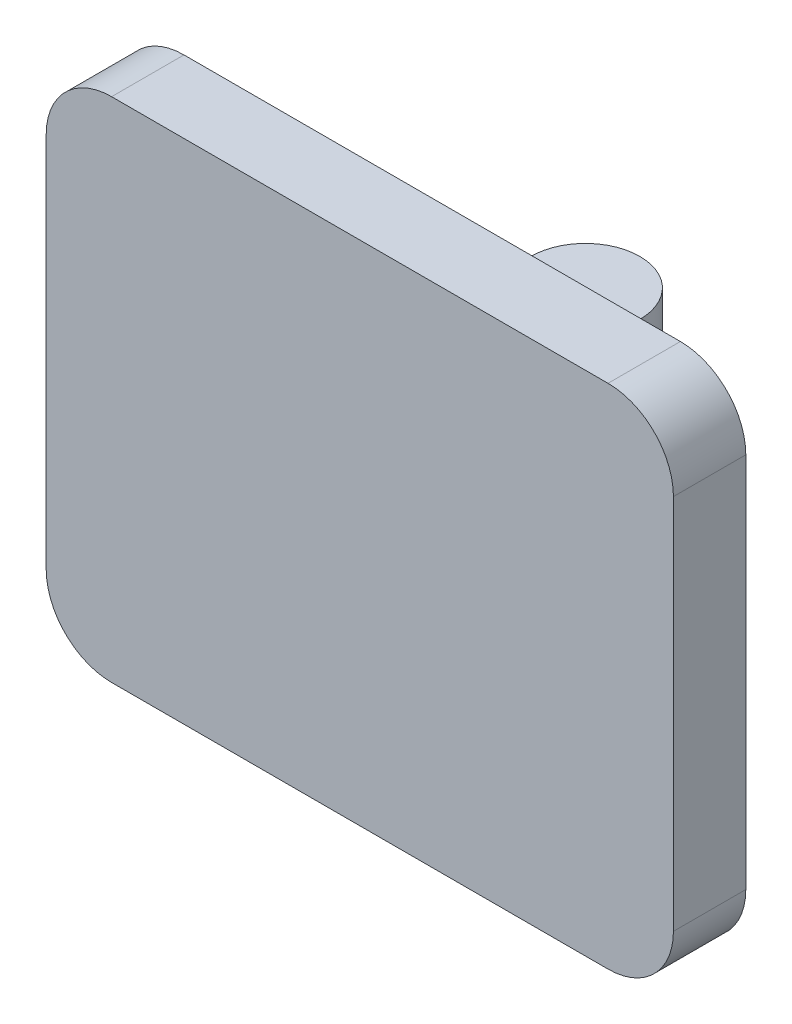
ISO-10303-21;
HEADER;
FILE_DESCRIPTION(('STEP AP214'),'2;1');
FILE_NAME('part.step','',(''),(''),'','','');
FILE_SCHEMA(('AUTOMOTIVE_DESIGN { 1 0 10303 214 1 1 1 1 }'));
ENDSEC;
DATA;
#1=APPLICATION_CONTEXT('core data for automotive mechanical design processes');
#2=APPLICATION_PROTOCOL_DEFINITION('international standard','automotive_design',2000,#1);
#3=PRODUCT_CONTEXT('',#1,'mechanical');
#4=PRODUCT('Part','Part','',(#3));
#5=PRODUCT_RELATED_PRODUCT_CATEGORY('part','',(#4));
#6=PRODUCT_DEFINITION_FORMATION('','',#4);
#7=PRODUCT_DEFINITION_CONTEXT('part definition',#1,'design');
#8=PRODUCT_DEFINITION('design','',#6,#7);
#9=PRODUCT_DEFINITION_SHAPE('','',#8);
#10=(LENGTH_UNIT() NAMED_UNIT(*) SI_UNIT(.MILLI.,.METRE.));
#11=(NAMED_UNIT(*) PLANE_ANGLE_UNIT() SI_UNIT($,.RADIAN.));
#12=(NAMED_UNIT(*) SI_UNIT($,.STERADIAN.) SOLID_ANGLE_UNIT());
#13=UNCERTAINTY_MEASURE_WITH_UNIT(LENGTH_MEASURE(1.E-05),#10,'distance_accuracy_value','');
#14=(GEOMETRIC_REPRESENTATION_CONTEXT(3) GLOBAL_UNCERTAINTY_ASSIGNED_CONTEXT((#13)) GLOBAL_UNIT_ASSIGNED_CONTEXT((#10,
#11,#12)) REPRESENTATION_CONTEXT('',''));
#15=CARTESIAN_POINT('',(0.,0.,0.));
#16=DIRECTION('',(0.,0.,1.));
#17=DIRECTION('',(1.,0.,0.));
#18=AXIS2_PLACEMENT_3D('',#15,#16,#17);
#19=CARTESIAN_POINT('',(113.85,-86.35,0.));
#20=DIRECTION('',(0.,0.,1.));
#21=DIRECTION('',(1.,0.,0.));
#22=AXIS2_PLACEMENT_3D('',#19,#20,#21);
#23=PLANE('',#22);
#24=CARTESIAN_POINT('',(56.845,-87.4,0.));
#25=DIRECTION('',(0.,0.,-1.));
#26=DIRECTION('',(-1.,0.,0.));
#27=AXIS2_PLACEMENT_3D('',#24,#25,#26);
#28=CIRCLE('',#27,6.50000000000001);
#29=CARTESIAN_POINT('',(56.845,-80.9,0.));
#30=VERTEX_POINT('',#29);
#31=CARTESIAN_POINT('',(56.845,-93.9,0.));
#32=VERTEX_POINT('',#31);
#33=EDGE_CURVE('E207',#30,#32,#28,.T.);
#34=ORIENTED_EDGE('',*,*,#33,.F.);
#35=DIRECTION('',(1.,0.,0.));
#36=VECTOR('',#35,1.);
#37=CARTESIAN_POINT('',(56.845,-80.9,0.));
#38=LINE('',#37,#36);
#39=CARTESIAN_POINT('',(-56.845,-80.9,0.));
#40=VERTEX_POINT('',#39);
#41=EDGE_CURVE('E212',#40,#30,#38,.T.);
#42=ORIENTED_EDGE('',*,*,#41,.F.);
#43=CARTESIAN_POINT('',(-56.845,-87.4,0.));
#44=DIRECTION('',(0.,0.,-1.));
#45=DIRECTION('',(-1.,0.,0.));
#46=AXIS2_PLACEMENT_3D('',#43,#44,#45);
#47=CIRCLE('',#46,6.50000000000001);
#48=CARTESIAN_POINT('',(-56.845,-93.9,0.));
#49=VERTEX_POINT('',#48);
#50=EDGE_CURVE('E222',#49,#40,#47,.T.);
#51=ORIENTED_EDGE('',*,*,#50,.F.);
#52=DIRECTION('',(-1.,0.,0.));
#53=VECTOR('',#52,1.);
#54=CARTESIAN_POINT('',(56.845,-93.9,0.));
#55=LINE('',#54,#53);
#56=EDGE_CURVE('E57',#32,#49,#55,.T.);
#57=ORIENTED_EDGE('',*,*,#56,.F.);
#58=EDGE_LOOP('',(#34,#42,#51,#57));
#59=FACE_BOUND('',#58,.T.);
#60=CARTESIAN_POINT('',(113.85,-86.35,0.));
#61=DIRECTION('',(0.,0.,1.));
#62=DIRECTION('',(1.,0.,0.));
#63=AXIS2_PLACEMENT_3D('',#60,#61,#62);
#64=CIRCLE('',#63,30.);
#65=CARTESIAN_POINT('',(113.85,-116.35,0.));
#66=VERTEX_POINT('',#65);
#67=CARTESIAN_POINT('',(143.85,-86.3499999999998,0.));
#68=VERTEX_POINT('',#67);
#69=EDGE_CURVE('E237',#66,#68,#64,.T.);
#70=ORIENTED_EDGE('',*,*,#69,.F.);
#71=DIRECTION('',(1.,0.,0.));
#72=VECTOR('',#71,1.);
#73=CARTESIAN_POINT('',(-113.85,-116.35,0.));
#74=LINE('',#73,#72);
#75=CARTESIAN_POINT('',(-113.85,-116.35,0.));
#76=VERTEX_POINT('',#75);
#77=EDGE_CURVE('E242',#76,#66,#74,.T.);
#78=ORIENTED_EDGE('',*,*,#77,.F.);
#79=CARTESIAN_POINT('',(-113.85,-86.35,0.));
#80=DIRECTION('',(0.,0.,1.));
#81=DIRECTION('',(1.,0.,0.));
#82=AXIS2_PLACEMENT_3D('',#79,#80,#81);
#83=CIRCLE('',#82,30.);
#84=CARTESIAN_POINT('',(-143.85,-86.3499999999998,0.));
#85=VERTEX_POINT('',#84);
#86=EDGE_CURVE('E269',#85,#76,#83,.T.);
#87=ORIENTED_EDGE('',*,*,#86,.F.);
#88=DIRECTION('',(0.,-1.,0.));
#89=VECTOR('',#88,1.);
#90=CARTESIAN_POINT('',(-143.85,86.3499999999998,0.));
#91=LINE('',#90,#89);
#92=CARTESIAN_POINT('',(-143.85,86.3499999999998,0.));
#93=VERTEX_POINT('',#92);
#94=EDGE_CURVE('E267',#93,#85,#91,.T.);
#95=ORIENTED_EDGE('',*,*,#94,.F.);
#96=CARTESIAN_POINT('',(-113.85,86.35,0.));
#97=DIRECTION('',(0.,0.,1.));
#98=DIRECTION('',(1.,0.,0.));
#99=AXIS2_PLACEMENT_3D('',#96,#97,#98);
#100=CIRCLE('',#99,30.);
#101=CARTESIAN_POINT('',(-113.85,116.35,0.));
#102=VERTEX_POINT('',#101);
#103=EDGE_CURVE('E265',#102,#93,#100,.T.);
#104=ORIENTED_EDGE('',*,*,#103,.F.);
#105=DIRECTION('',(-1.,0.,0.));
#106=VECTOR('',#105,1.);
#107=CARTESIAN_POINT('',(-113.85,116.35,0.));
#108=LINE('',#107,#106);
#109=CARTESIAN_POINT('',(113.85,116.35,0.));
#110=VERTEX_POINT('',#109);
#111=EDGE_CURVE('E263',#110,#102,#108,.T.);
#112=ORIENTED_EDGE('',*,*,#111,.F.);
#113=CARTESIAN_POINT('',(113.85,86.35,0.));
#114=DIRECTION('',(0.,0.,1.));
#115=DIRECTION('',(-1.,0.,0.));
#116=AXIS2_PLACEMENT_3D('',#113,#114,#115);
#117=CIRCLE('',#116,30.);
#118=CARTESIAN_POINT('',(143.85,86.3499999999998,0.));
#119=VERTEX_POINT('',#118);
#120=EDGE_CURVE('E261',#119,#110,#117,.T.);
#121=ORIENTED_EDGE('',*,*,#120,.F.);
#122=DIRECTION('',(0.,1.,0.));
#123=VECTOR('',#122,1.);
#124=CARTESIAN_POINT('',(143.85,86.3499999999998,0.));
#125=LINE('',#124,#123);
#126=EDGE_CURVE('E259',#68,#119,#125,.T.);
#127=ORIENTED_EDGE('',*,*,#126,.F.);
#128=EDGE_LOOP('',(#70,#78,#87,#95,#104,#112,#121,#127));
#129=FACE_BOUND('',#128,.T.);
#130=DIRECTION('',(-1.,0.,0.));
#131=VECTOR('',#130,1.);
#132=CARTESIAN_POINT('',(0.,11.65,0.));
#133=LINE('',#132,#131);
#134=CARTESIAN_POINT('',(47.95,11.65,0.));
#135=VERTEX_POINT('',#134);
#136=CARTESIAN_POINT('',(31.95,11.65,0.));
#137=VERTEX_POINT('',#136);
#138=EDGE_CURVE('E173',#135,#137,#133,.T.);
#139=ORIENTED_EDGE('',*,*,#138,.F.);
#140=DIRECTION('',(0.,1.,0.));
#141=VECTOR('',#140,1.);
#142=CARTESIAN_POINT('',(47.95,11.65,0.));
#143=LINE('',#142,#141);
#144=CARTESIAN_POINT('',(47.95,85.55,0.));
#145=VERTEX_POINT('',#144);
#146=EDGE_CURVE('E192',#135,#145,#143,.T.);
#147=ORIENTED_EDGE('',*,*,#146,.T.);
#148=DIRECTION('',(-1.,0.,0.));
#149=VECTOR('',#148,1.);
#150=CARTESIAN_POINT('',(0.,85.55,0.));
#151=LINE('',#150,#149);
#152=CARTESIAN_POINT('',(31.95,85.55,0.));
#153=VERTEX_POINT('',#152);
#154=EDGE_CURVE('E185',#145,#153,#151,.T.);
#155=ORIENTED_EDGE('',*,*,#154,.T.);
#156=DIRECTION('',(0.,1.,0.));
#157=VECTOR('',#156,1.);
#158=CARTESIAN_POINT('',(31.95,11.65,0.));
#159=LINE('',#158,#157);
#160=EDGE_CURVE('E158',#137,#153,#159,.T.);
#161=ORIENTED_EDGE('',*,*,#160,.F.);
#162=EDGE_LOOP('',(#139,#147,#155,#161));
#163=FACE_BOUND('',#162,.T.);
#164=ADVANCED_FACE('F34',(#59,#129,#163),#23,.F.);
#165=CARTESIAN_POINT('',(113.85,-86.35,33.2));
#166=DIRECTION('',(0.,0.,-1.));
#167=DIRECTION('',(-1.,0.,0.));
#168=AXIS2_PLACEMENT_3D('',#165,#166,#167);
#169=CYLINDRICAL_SURFACE('',#168,30.);
#170=ORIENTED_EDGE('',*,*,#69,.T.);
#171=DIRECTION('',(0.,0.,-1.));
#172=VECTOR('',#171,1.);
#173=CARTESIAN_POINT('',(143.85,-86.3499999999998,33.2));
#174=LINE('',#173,#172);
#175=CARTESIAN_POINT('',(143.85,-86.3499999999998,33.2));
#176=VERTEX_POINT('',#175);
#177=EDGE_CURVE('E11',#176,#68,#174,.T.);
#178=ORIENTED_EDGE('',*,*,#177,.F.);
#179=CARTESIAN_POINT('',(113.85,-86.35,33.2));
#180=DIRECTION('',(0.,0.,1.));
#181=DIRECTION('',(1.,0.,0.));
#182=AXIS2_PLACEMENT_3D('',#179,#180,#181);
#183=CIRCLE('',#182,30.);
#184=CARTESIAN_POINT('',(113.85,-116.35,33.2));
#185=VERTEX_POINT('',#184);
#186=EDGE_CURVE('E238',#185,#176,#183,.T.);
#187=ORIENTED_EDGE('',*,*,#186,.F.);
#188=DIRECTION('',(0.,0.,-1.));
#189=VECTOR('',#188,1.);
#190=CARTESIAN_POINT('',(113.85,-116.35,33.2));
#191=LINE('',#190,#189);
#192=EDGE_CURVE('E256',#185,#66,#191,.T.);
#193=ORIENTED_EDGE('',*,*,#192,.T.);
#194=EDGE_LOOP('',(#170,#178,#187,#193));
#195=FACE_BOUND('',#194,.T.);
#196=ADVANCED_FACE('F36',(#195),#169,.T.);
#197=CARTESIAN_POINT('',(143.85,86.3499999999998,33.2));
#198=DIRECTION('',(-1.,0.,0.));
#199=DIRECTION('',(0.,0.,1.));
#200=AXIS2_PLACEMENT_3D('',#197,#198,#199);
#201=PLANE('',#200);
#202=ORIENTED_EDGE('',*,*,#126,.T.);
#203=DIRECTION('',(0.,0.,-1.));
#204=VECTOR('',#203,1.);
#205=CARTESIAN_POINT('',(143.85,86.3499999999998,33.2));
#206=LINE('',#205,#204);
#207=CARTESIAN_POINT('',(143.85,86.3499999999998,33.2));
#208=VERTEX_POINT('',#207);
#209=EDGE_CURVE('E42',#208,#119,#206,.T.);
#210=ORIENTED_EDGE('',*,*,#209,.F.);
#211=DIRECTION('',(0.,1.,0.));
#212=VECTOR('',#211,1.);
#213=CARTESIAN_POINT('',(143.85,86.3499999999998,33.2));
#214=LINE('',#213,#212);
#215=EDGE_CURVE('E241',#176,#208,#214,.T.);
#216=ORIENTED_EDGE('',*,*,#215,.F.);
#217=ORIENTED_EDGE('',*,*,#177,.T.);
#218=EDGE_LOOP('',(#202,#210,#216,#217));
#219=FACE_BOUND('',#218,.T.);
#220=ADVANCED_FACE('F316',(#219),#201,.F.);
#221=CARTESIAN_POINT('',(113.85,86.35,33.2));
#222=DIRECTION('',(0.,0.,-1.));
#223=DIRECTION('',(-1.,0.,0.));
#224=AXIS2_PLACEMENT_3D('',#221,#222,#223);
#225=CYLINDRICAL_SURFACE('',#224,30.);
#226=ORIENTED_EDGE('',*,*,#120,.T.);
#227=DIRECTION('',(0.,0.,-1.));
#228=VECTOR('',#227,1.);
#229=CARTESIAN_POINT('',(113.85,116.35,33.2));
#230=LINE('',#229,#228);
#231=CARTESIAN_POINT('',(113.85,116.35,33.2));
#232=VERTEX_POINT('',#231);
#233=EDGE_CURVE('E286',#232,#110,#230,.T.);
#234=ORIENTED_EDGE('',*,*,#233,.F.);
#235=CARTESIAN_POINT('',(113.85,86.35,33.2));
#236=DIRECTION('',(0.,0.,1.));
#237=DIRECTION('',(-1.,0.,0.));
#238=AXIS2_PLACEMENT_3D('',#235,#236,#237);
#239=CIRCLE('',#238,30.);
#240=EDGE_CURVE('E244',#208,#232,#239,.T.);
#241=ORIENTED_EDGE('',*,*,#240,.F.);
#242=ORIENTED_EDGE('',*,*,#209,.T.);
#243=EDGE_LOOP('',(#226,#234,#241,#242));
#244=FACE_BOUND('',#243,.T.);
#245=ADVANCED_FACE('F293',(#244),#225,.T.);
#246=CARTESIAN_POINT('',(-113.85,116.35,33.2));
#247=DIRECTION('',(0.,-1.,0.));
#248=DIRECTION('',(0.,0.,-1.));
#249=AXIS2_PLACEMENT_3D('',#246,#247,#248);
#250=PLANE('',#249);
#251=ORIENTED_EDGE('',*,*,#111,.T.);
#252=DIRECTION('',(0.,0.,-1.));
#253=VECTOR('',#252,1.);
#254=CARTESIAN_POINT('',(-113.85,116.35,33.2));
#255=LINE('',#254,#253);
#256=CARTESIAN_POINT('',(-113.85,116.35,33.2));
#257=VERTEX_POINT('',#256);
#258=EDGE_CURVE('E283',#257,#102,#255,.T.);
#259=ORIENTED_EDGE('',*,*,#258,.F.);
#260=DIRECTION('',(-1.,0.,0.));
#261=VECTOR('',#260,1.);
#262=CARTESIAN_POINT('',(-113.85,116.35,33.2));
#263=LINE('',#262,#261);
#264=EDGE_CURVE('E246',#232,#257,#263,.T.);
#265=ORIENTED_EDGE('',*,*,#264,.F.);
#266=ORIENTED_EDGE('',*,*,#233,.T.);
#267=EDGE_LOOP('',(#251,#259,#265,#266));
#268=FACE_BOUND('',#267,.T.);
#269=ADVANCED_FACE('F304',(#268),#250,.F.);
#270=CARTESIAN_POINT('',(-113.85,86.35,33.2));
#271=DIRECTION('',(0.,0.,-1.));
#272=DIRECTION('',(-1.,0.,0.));
#273=AXIS2_PLACEMENT_3D('',#270,#271,#272);
#274=CYLINDRICAL_SURFACE('',#273,30.);
#275=ORIENTED_EDGE('',*,*,#103,.T.);
#276=DIRECTION('',(0.,0.,-1.));
#277=VECTOR('',#276,1.);
#278=CARTESIAN_POINT('',(-143.85,86.3499999999998,33.2));
#279=LINE('',#278,#277);
#280=CARTESIAN_POINT('',(-143.85,86.3499999999998,33.2));
#281=VERTEX_POINT('',#280);
#282=EDGE_CURVE('E280',#281,#93,#279,.T.);
#283=ORIENTED_EDGE('',*,*,#282,.F.);
#284=CARTESIAN_POINT('',(-113.85,86.35,33.2));
#285=DIRECTION('',(0.,0.,1.));
#286=DIRECTION('',(1.,0.,0.));
#287=AXIS2_PLACEMENT_3D('',#284,#285,#286);
#288=CIRCLE('',#287,30.);
#289=EDGE_CURVE('E248',#257,#281,#288,.T.);
#290=ORIENTED_EDGE('',*,*,#289,.F.);
#291=ORIENTED_EDGE('',*,*,#258,.T.);
#292=EDGE_LOOP('',(#275,#283,#290,#291));
#293=FACE_BOUND('',#292,.T.);
#294=ADVANCED_FACE('F308',(#293),#274,.T.);
#295=CARTESIAN_POINT('',(-143.85,86.3499999999998,33.2));
#296=DIRECTION('',(1.,0.,0.));
#297=DIRECTION('',(0.,1.,0.));
#298=AXIS2_PLACEMENT_3D('',#295,#296,#297);
#299=PLANE('',#298);
#300=ORIENTED_EDGE('',*,*,#94,.T.);
#301=DIRECTION('',(0.,0.,-1.));
#302=VECTOR('',#301,1.);
#303=CARTESIAN_POINT('',(-143.85,-86.3499999999998,33.2));
#304=LINE('',#303,#302);
#305=CARTESIAN_POINT('',(-143.85,-86.3499999999998,33.2));
#306=VERTEX_POINT('',#305);
#307=EDGE_CURVE('E277',#306,#85,#304,.T.);
#308=ORIENTED_EDGE('',*,*,#307,.F.);
#309=DIRECTION('',(0.,-1.,0.));
#310=VECTOR('',#309,1.);
#311=CARTESIAN_POINT('',(-143.85,86.3499999999998,33.2));
#312=LINE('',#311,#310);
#313=EDGE_CURVE('E250',#281,#306,#312,.T.);
#314=ORIENTED_EDGE('',*,*,#313,.F.);
#315=ORIENTED_EDGE('',*,*,#282,.T.);
#316=EDGE_LOOP('',(#300,#308,#314,#315));
#317=FACE_BOUND('',#316,.T.);
#318=ADVANCED_FACE('F329',(#317),#299,.F.);
#319=CARTESIAN_POINT('',(-113.85,-86.35,33.2));
#320=DIRECTION('',(0.,0.,-1.));
#321=DIRECTION('',(-1.,0.,0.));
#322=AXIS2_PLACEMENT_3D('',#319,#320,#321);
#323=CYLINDRICAL_SURFACE('',#322,30.);
#324=ORIENTED_EDGE('',*,*,#86,.T.);
#325=DIRECTION('',(0.,0.,-1.));
#326=VECTOR('',#325,1.);
#327=CARTESIAN_POINT('',(-113.85,-116.35,33.2));
#328=LINE('',#327,#326);
#329=CARTESIAN_POINT('',(-113.85,-116.35,33.2));
#330=VERTEX_POINT('',#329);
#331=EDGE_CURVE('E274',#330,#76,#328,.T.);
#332=ORIENTED_EDGE('',*,*,#331,.F.);
#333=CARTESIAN_POINT('',(-113.85,-86.35,33.2));
#334=DIRECTION('',(0.,0.,1.));
#335=DIRECTION('',(1.,0.,0.));
#336=AXIS2_PLACEMENT_3D('',#333,#334,#335);
#337=CIRCLE('',#336,30.);
#338=EDGE_CURVE('E252',#306,#330,#337,.T.);
#339=ORIENTED_EDGE('',*,*,#338,.F.);
#340=ORIENTED_EDGE('',*,*,#307,.T.);
#341=EDGE_LOOP('',(#324,#332,#339,#340));
#342=FACE_BOUND('',#341,.T.);
#343=ADVANCED_FACE('F327',(#342),#323,.T.);
#344=CARTESIAN_POINT('',(-113.85,-116.35,33.2));
#345=DIRECTION('',(0.,1.,0.));
#346=DIRECTION('',(0.,0.,1.));
#347=AXIS2_PLACEMENT_3D('',#344,#345,#346);
#348=PLANE('',#347);
#349=ORIENTED_EDGE('',*,*,#77,.T.);
#350=ORIENTED_EDGE('',*,*,#192,.F.);
#351=DIRECTION('',(1.,0.,0.));
#352=VECTOR('',#351,1.);
#353=CARTESIAN_POINT('',(-113.85,-116.35,33.2));
#354=LINE('',#353,#352);
#355=EDGE_CURVE('E254',#330,#185,#354,.T.);
#356=ORIENTED_EDGE('',*,*,#355,.F.);
#357=ORIENTED_EDGE('',*,*,#331,.T.);
#358=EDGE_LOOP('',(#349,#350,#356,#357));
#359=FACE_BOUND('',#358,.T.);
#360=ADVANCED_FACE('F322',(#359),#348,.F.);
#361=CARTESIAN_POINT('',(113.85,-86.35,33.2));
#362=DIRECTION('',(0.,0.,1.));
#363=DIRECTION('',(1.,0.,0.));
#364=AXIS2_PLACEMENT_3D('',#361,#362,#363);
#365=PLANE('',#364);
#366=ORIENTED_EDGE('',*,*,#186,.T.);
#367=ORIENTED_EDGE('',*,*,#215,.T.);
#368=ORIENTED_EDGE('',*,*,#240,.T.);
#369=ORIENTED_EDGE('',*,*,#264,.T.);
#370=ORIENTED_EDGE('',*,*,#289,.T.);
#371=ORIENTED_EDGE('',*,*,#313,.T.);
#372=ORIENTED_EDGE('',*,*,#338,.T.);
#373=ORIENTED_EDGE('',*,*,#355,.T.);
#374=EDGE_LOOP('',(#366,#367,#368,#369,#370,#371,#372,#373));
#375=FACE_BOUND('',#374,.T.);
#376=ADVANCED_FACE('F312',(#375),#365,.T.);
#377=CARTESIAN_POINT('',(56.845,-87.4,-4.8));
#378=DIRECTION('',(0.,0.,1.));
#379=DIRECTION('',(1.,0.,0.));
#380=AXIS2_PLACEMENT_3D('',#377,#378,#379);
#381=CYLINDRICAL_SURFACE('',#380,6.50000000000001);
#382=ORIENTED_EDGE('',*,*,#33,.T.);
#383=DIRECTION('',(0.,0.,1.));
#384=VECTOR('',#383,1.);
#385=CARTESIAN_POINT('',(56.845,-93.9,-4.8));
#386=LINE('',#385,#384);
#387=CARTESIAN_POINT('',(56.845,-93.9,-4.8));
#388=VERTEX_POINT('',#387);
#389=EDGE_CURVE('E235',#388,#32,#386,.T.);
#390=ORIENTED_EDGE('',*,*,#389,.F.);
#391=CARTESIAN_POINT('',(56.845,-87.4,-4.8));
#392=DIRECTION('',(0.,0.,-1.));
#393=DIRECTION('',(-1.,0.,0.));
#394=AXIS2_PLACEMENT_3D('',#391,#392,#393);
#395=CIRCLE('',#394,6.50000000000001);
#396=CARTESIAN_POINT('',(56.845,-80.9,-4.8));
#397=VERTEX_POINT('',#396);
#398=EDGE_CURVE('E208',#397,#388,#395,.T.);
#399=ORIENTED_EDGE('',*,*,#398,.F.);
#400=DIRECTION('',(0.,0.,1.));
#401=VECTOR('',#400,1.);
#402=CARTESIAN_POINT('',(56.845,-80.9,-4.8));
#403=LINE('',#402,#401);
#404=EDGE_CURVE('E218',#397,#30,#403,.T.);
#405=ORIENTED_EDGE('',*,*,#404,.T.);
#406=EDGE_LOOP('',(#382,#390,#399,#405));
#407=FACE_BOUND('',#406,.T.);
#408=ADVANCED_FACE('F350',(#407),#381,.T.);
#409=CARTESIAN_POINT('',(56.845,-93.9,-4.8));
#410=DIRECTION('',(0.,1.,0.));
#411=DIRECTION('',(0.,0.,1.));
#412=AXIS2_PLACEMENT_3D('',#409,#410,#411);
#413=PLANE('',#412);
#414=ORIENTED_EDGE('',*,*,#56,.T.);
#415=DIRECTION('',(0.,0.,1.));
#416=VECTOR('',#415,1.);
#417=CARTESIAN_POINT('',(-56.845,-93.9,-4.8));
#418=LINE('',#417,#416);
#419=CARTESIAN_POINT('',(-56.845,-93.9,-4.8));
#420=VERTEX_POINT('',#419);
#421=EDGE_CURVE('E232',#420,#49,#418,.T.);
#422=ORIENTED_EDGE('',*,*,#421,.F.);
#423=DIRECTION('',(-1.,0.,0.));
#424=VECTOR('',#423,1.);
#425=CARTESIAN_POINT('',(56.845,-93.9,-4.8));
#426=LINE('',#425,#424);
#427=EDGE_CURVE('E211',#388,#420,#426,.T.);
#428=ORIENTED_EDGE('',*,*,#427,.F.);
#429=ORIENTED_EDGE('',*,*,#389,.T.);
#430=EDGE_LOOP('',(#414,#422,#428,#429));
#431=FACE_BOUND('',#430,.T.);
#432=ADVANCED_FACE('F354',(#431),#413,.F.);
#433=CARTESIAN_POINT('',(-56.845,-87.4,-4.8));
#434=DIRECTION('',(0.,0.,1.));
#435=DIRECTION('',(1.,0.,0.));
#436=AXIS2_PLACEMENT_3D('',#433,#434,#435);
#437=CYLINDRICAL_SURFACE('',#436,6.50000000000001);
#438=ORIENTED_EDGE('',*,*,#50,.T.);
#439=DIRECTION('',(0.,0.,1.));
#440=VECTOR('',#439,1.);
#441=CARTESIAN_POINT('',(-56.845,-80.9,-4.8));
#442=LINE('',#441,#440);
#443=CARTESIAN_POINT('',(-56.845,-80.9,-4.8));
#444=VERTEX_POINT('',#443);
#445=EDGE_CURVE('E229',#444,#40,#442,.T.);
#446=ORIENTED_EDGE('',*,*,#445,.F.);
#447=CARTESIAN_POINT('',(-56.845,-87.4,-4.8));
#448=DIRECTION('',(0.,0.,-1.));
#449=DIRECTION('',(-1.,0.,0.));
#450=AXIS2_PLACEMENT_3D('',#447,#448,#449);
#451=CIRCLE('',#450,6.50000000000001);
#452=EDGE_CURVE('E214',#420,#444,#451,.T.);
#453=ORIENTED_EDGE('',*,*,#452,.F.);
#454=ORIENTED_EDGE('',*,*,#421,.T.);
#455=EDGE_LOOP('',(#438,#446,#453,#454));
#456=FACE_BOUND('',#455,.T.);
#457=ADVANCED_FACE('F359',(#456),#437,.T.);
#458=CARTESIAN_POINT('',(56.845,-80.9,-4.8));
#459=DIRECTION('',(0.,-1.,0.));
#460=DIRECTION('',(0.,0.,-1.));
#461=AXIS2_PLACEMENT_3D('',#458,#459,#460);
#462=PLANE('',#461);
#463=ORIENTED_EDGE('',*,*,#41,.T.);
#464=ORIENTED_EDGE('',*,*,#404,.F.);
#465=DIRECTION('',(1.,0.,0.));
#466=VECTOR('',#465,1.);
#467=CARTESIAN_POINT('',(56.845,-80.9,-4.8));
#468=LINE('',#467,#466);
#469=EDGE_CURVE('E216',#444,#397,#468,.T.);
#470=ORIENTED_EDGE('',*,*,#469,.F.);
#471=ORIENTED_EDGE('',*,*,#445,.T.);
#472=EDGE_LOOP('',(#463,#464,#470,#471));
#473=FACE_BOUND('',#472,.T.);
#474=ADVANCED_FACE('F365',(#473),#462,.F.);
#475=CARTESIAN_POINT('',(56.845,-87.4,-4.8));
#476=DIRECTION('',(0.,0.,-1.));
#477=DIRECTION('',(-1.,0.,0.));
#478=AXIS2_PLACEMENT_3D('',#475,#476,#477);
#479=PLANE('',#478);
#480=CARTESIAN_POINT('',(13.995,-87.4,-4.8));
#481=DIRECTION('',(0.,0.,-1.));
#482=DIRECTION('',(-1.,0.,0.));
#483=AXIS2_PLACEMENT_3D('',#480,#481,#482);
#484=CIRCLE('',#483,2.1);
#485=CARTESIAN_POINT('',(11.895,-87.4,-4.8));
#486=VERTEX_POINT('',#485);
#487=EDGE_CURVE('E167',#486,#486,#484,.T.);
#488=ORIENTED_EDGE('',*,*,#487,.F.);
#489=EDGE_LOOP('',(#488));
#490=FACE_BOUND('',#489,.T.);
#491=CARTESIAN_POINT('',(-14.005,-87.4,-4.8));
#492=DIRECTION('',(0.,0.,-1.));
#493=DIRECTION('',(-1.,0.,0.));
#494=AXIS2_PLACEMENT_3D('',#491,#492,#493);
#495=CIRCLE('',#494,2.1);
#496=CARTESIAN_POINT('',(-16.105,-87.4,-4.8));
#497=VERTEX_POINT('',#496);
#498=EDGE_CURVE('E201',#497,#497,#495,.T.);
#499=ORIENTED_EDGE('',*,*,#498,.F.);
#500=EDGE_LOOP('',(#499));
#501=FACE_BOUND('',#500,.T.);
#502=ORIENTED_EDGE('',*,*,#398,.T.);
#503=ORIENTED_EDGE('',*,*,#427,.T.);
#504=ORIENTED_EDGE('',*,*,#452,.T.);
#505=ORIENTED_EDGE('',*,*,#469,.T.);
#506=EDGE_LOOP('',(#502,#503,#504,#505));
#507=FACE_BOUND('',#506,.T.);
#508=ADVANCED_FACE('F369',(#490,#501,#507),#479,.T.);
#509=CARTESIAN_POINT('',(-14.005,-87.4,0.));
#510=DIRECTION('',(0.,0.,1.));
#511=DIRECTION('',(1.,0.,0.));
#512=AXIS2_PLACEMENT_3D('',#509,#510,#511);
#513=PLANE('',#512);
#514=CARTESIAN_POINT('',(-14.005,-87.4,0.));
#515=DIRECTION('',(0.,0.,-1.));
#516=DIRECTION('',(-1.,0.,0.));
#517=AXIS2_PLACEMENT_3D('',#514,#515,#516);
#518=CIRCLE('',#517,2.1);
#519=CARTESIAN_POINT('',(-16.105,-87.4,0.));
#520=VERTEX_POINT('',#519);
#521=EDGE_CURVE('E204',#520,#520,#518,.T.);
#522=ORIENTED_EDGE('',*,*,#521,.T.);
#523=EDGE_LOOP('',(#522));
#524=FACE_BOUND('',#523,.T.);
#525=ADVANCED_FACE('F373',(#524),#513,.F.);
#526=CARTESIAN_POINT('',(-14.005,-87.4,-4.8));
#527=DIRECTION('',(0.,0.,-1.));
#528=DIRECTION('',(-1.,0.,0.));
#529=AXIS2_PLACEMENT_3D('',#526,#527,#528);
#530=CYLINDRICAL_SURFACE('',#529,2.1);
#531=ORIENTED_EDGE('',*,*,#521,.F.);
#532=EDGE_LOOP('',(#531));
#533=FACE_BOUND('',#532,.T.);
#534=ORIENTED_EDGE('',*,*,#498,.T.);
#535=EDGE_LOOP('',(#534));
#536=FACE_BOUND('',#535,.T.);
#537=ADVANCED_FACE('F377',(#533,#536),#530,.F.);
#538=CARTESIAN_POINT('',(13.995,-87.4,0.));
#539=DIRECTION('',(0.,0.,1.));
#540=DIRECTION('',(1.,0.,0.));
#541=AXIS2_PLACEMENT_3D('',#538,#539,#540);
#542=PLANE('',#541);
#543=CARTESIAN_POINT('',(13.995,-87.4,0.));
#544=DIRECTION('',(0.,0.,-1.));
#545=DIRECTION('',(-1.,0.,0.));
#546=AXIS2_PLACEMENT_3D('',#543,#544,#545);
#547=CIRCLE('',#546,2.1);
#548=CARTESIAN_POINT('',(11.895,-87.4,0.));
#549=VERTEX_POINT('',#548);
#550=EDGE_CURVE('E198',#549,#549,#547,.T.);
#551=ORIENTED_EDGE('',*,*,#550,.T.);
#552=EDGE_LOOP('',(#551));
#553=FACE_BOUND('',#552,.T.);
#554=ADVANCED_FACE('F381',(#553),#542,.F.);
#555=CARTESIAN_POINT('',(13.995,-87.4,-4.8));
#556=DIRECTION('',(0.,0.,-1.));
#557=DIRECTION('',(-1.,0.,0.));
#558=AXIS2_PLACEMENT_3D('',#555,#556,#557);
#559=CYLINDRICAL_SURFACE('',#558,2.1);
#560=ORIENTED_EDGE('',*,*,#550,.F.);
#561=EDGE_LOOP('',(#560));
#562=FACE_BOUND('',#561,.T.);
#563=ORIENTED_EDGE('',*,*,#487,.T.);
#564=EDGE_LOOP('',(#563));
#565=FACE_BOUND('',#564,.T.);
#566=ADVANCED_FACE('F385',(#562,#565),#559,.F.);
#567=CARTESIAN_POINT('',(31.95,11.65,0.));
#568=DIRECTION('',(1.,0.,0.));
#569=DIRECTION('',(0.,0.,-1.));
#570=AXIS2_PLACEMENT_3D('',#567,#568,#569);
#571=PLANE('',#570);
#572=DIRECTION('',(0.,0.,-1.));
#573=VECTOR('',#572,1.);
#574=CARTESIAN_POINT('',(31.95,85.55,0.));
#575=LINE('',#574,#573);
#576=CARTESIAN_POINT('',(31.95,85.55,-6.61456143534599));
#577=VERTEX_POINT('',#576);
#578=EDGE_CURVE('E49',#153,#577,#575,.T.);
#579=ORIENTED_EDGE('',*,*,#578,.T.);
#580=DIRECTION('',(0.,1.,0.));
#581=VECTOR('',#580,1.);
#582=CARTESIAN_POINT('',(31.95,11.65,-6.61456143534599));
#583=LINE('',#582,#581);
#584=CARTESIAN_POINT('',(31.95,11.65,-6.61456143534599));
#585=VERTEX_POINT('',#584);
#586=EDGE_CURVE('E153',#585,#577,#583,.T.);
#587=ORIENTED_EDGE('',*,*,#586,.F.);
#588=DIRECTION('',(0.,0.,-1.));
#589=VECTOR('',#588,1.);
#590=CARTESIAN_POINT('',(31.95,11.65,0.));
#591=LINE('',#590,#589);
#592=EDGE_CURVE('E165',#137,#585,#591,.T.);
#593=ORIENTED_EDGE('',*,*,#592,.F.);
#594=ORIENTED_EDGE('',*,*,#160,.T.);
#595=EDGE_LOOP('',(#579,#587,#593,#594));
#596=FACE_BOUND('',#595,.T.);
#597=ADVANCED_FACE('F164',(#596),#571,.F.);
#598=CARTESIAN_POINT('',(39.95,11.65,-30.3));
#599=DIRECTION('',(0.,1.,0.));
#600=DIRECTION('',(0.,0.,1.));
#601=AXIS2_PLACEMENT_3D('',#598,#599,#600);
#602=CYLINDRICAL_SURFACE('',#601,25.);
#603=CARTESIAN_POINT('',(39.95,85.55,-30.3));
#604=DIRECTION('',(0.,1.,0.));
#605=DIRECTION('',(0.,0.,1.));
#606=AXIS2_PLACEMENT_3D('',#603,#604,#605);
#607=CIRCLE('',#606,25.);
#608=CARTESIAN_POINT('',(47.95,85.55,-6.61456143534599));
#609=VERTEX_POINT('',#608);
#610=EDGE_CURVE('E174',#609,#577,#607,.T.);
#611=ORIENTED_EDGE('',*,*,#610,.F.);
#612=DIRECTION('',(0.,1.,0.));
#613=VECTOR('',#612,1.);
#614=CARTESIAN_POINT('',(47.95,11.65,-6.61456143534599));
#615=LINE('',#614,#613);
#616=CARTESIAN_POINT('',(47.95,11.65,-6.61456143534599));
#617=VERTEX_POINT('',#616);
#618=EDGE_CURVE('E154',#617,#609,#615,.T.);
#619=ORIENTED_EDGE('',*,*,#618,.F.);
#620=CARTESIAN_POINT('',(39.95,11.65,-30.3));
#621=DIRECTION('',(0.,1.,0.));
#622=DIRECTION('',(0.,0.,1.));
#623=AXIS2_PLACEMENT_3D('',#620,#621,#622);
#624=CIRCLE('',#623,25.);
#625=EDGE_CURVE('E149',#617,#585,#624,.T.);
#626=ORIENTED_EDGE('',*,*,#625,.T.);
#627=ORIENTED_EDGE('',*,*,#586,.T.);
#628=EDGE_LOOP('',(#611,#619,#626,#627));
#629=FACE_BOUND('',#628,.T.);
#630=ADVANCED_FACE('F152',(#629),#602,.T.);
#631=CARTESIAN_POINT('',(47.95,11.65,0.));
#632=DIRECTION('',(-1.,0.,0.));
#633=DIRECTION('',(0.,0.,1.));
#634=AXIS2_PLACEMENT_3D('',#631,#632,#633);
#635=PLANE('',#634);
#636=DIRECTION('',(0.,0.,1.));
#637=VECTOR('',#636,1.);
#638=CARTESIAN_POINT('',(47.95,85.55,0.));
#639=LINE('',#638,#637);
#640=EDGE_CURVE('E188',#609,#145,#639,.T.);
#641=ORIENTED_EDGE('',*,*,#640,.T.);
#642=ORIENTED_EDGE('',*,*,#146,.F.);
#643=DIRECTION('',(0.,0.,1.));
#644=VECTOR('',#643,1.);
#645=CARTESIAN_POINT('',(47.95,11.65,0.));
#646=LINE('',#645,#644);
#647=EDGE_CURVE('E159',#617,#135,#646,.T.);
#648=ORIENTED_EDGE('',*,*,#647,.F.);
#649=ORIENTED_EDGE('',*,*,#618,.T.);
#650=EDGE_LOOP('',(#641,#642,#648,#649));
#651=FACE_BOUND('',#650,.T.);
#652=ADVANCED_FACE('F392',(#651),#635,.F.);
#653=CARTESIAN_POINT('',(0.,11.65,0.));
#654=DIRECTION('',(0.,1.,0.));
#655=DIRECTION('',(0.,0.,1.));
#656=AXIS2_PLACEMENT_3D('',#653,#654,#655);
#657=PLANE('',#656);
#658=CARTESIAN_POINT('',(39.95,11.65,-30.3));
#659=DIRECTION('',(0.,-1.,0.));
#660=DIRECTION('',(0.,0.,-1.));
#661=AXIS2_PLACEMENT_3D('',#658,#659,#660);
#662=CIRCLE('',#661,25.);
#663=EDGE_CURVE('E171',#617,#585,#662,.T.);
#664=ORIENTED_EDGE('',*,*,#663,.F.);
#665=ORIENTED_EDGE('',*,*,#647,.T.);
#666=ORIENTED_EDGE('',*,*,#138,.T.);
#667=ORIENTED_EDGE('',*,*,#592,.T.);
#668=EDGE_LOOP('',(#664,#665,#666,#667));
#669=FACE_BOUND('',#668,.T.);
#670=ADVANCED_FACE('F170',(#669),#657,.F.);
#671=CARTESIAN_POINT('',(0.,85.55,0.));
#672=DIRECTION('',(0.,1.,0.));
#673=DIRECTION('',(0.,0.,1.));
#674=AXIS2_PLACEMENT_3D('',#671,#672,#673);
#675=PLANE('',#674);
#676=ORIENTED_EDGE('',*,*,#578,.F.);
#677=ORIENTED_EDGE('',*,*,#154,.F.);
#678=ORIENTED_EDGE('',*,*,#640,.F.);
#679=ORIENTED_EDGE('',*,*,#610,.T.);
#680=EDGE_LOOP('',(#676,#677,#678,#679));
#681=FACE_BOUND('',#680,.T.);
#682=ADVANCED_FACE('F398',(#681),#675,.T.);
#683=CARTESIAN_POINT('',(39.95,11.65,-30.3));
#684=DIRECTION('',(0.,1.,0.));
#685=DIRECTION('',(0.,0.,-1.));
#686=AXIS2_PLACEMENT_3D('',#683,#684,#685);
#687=CONICAL_SURFACE('',#686,25.,0.122173047639603);
#688=CARTESIAN_POINT('',(39.95,-88.35,-30.3));
#689=DIRECTION('',(0.,-1.,0.));
#690=DIRECTION('',(0.,0.,-1.));
#691=AXIS2_PLACEMENT_3D('',#688,#689,#690);
#692=CIRCLE('',#691,12.7215439097095);
#693=CARTESIAN_POINT('',(39.95,-88.35,-43.0215439097095));
#694=VERTEX_POINT('',#693);
#695=EDGE_CURVE('E177',#694,#694,#692,.T.);
#696=ORIENTED_EDGE('',*,*,#695,.F.);
#697=EDGE_LOOP('',(#696));
#698=FACE_BOUND('',#697,.T.);
#699=ORIENTED_EDGE('',*,*,#663,.T.);
#700=ORIENTED_EDGE('',*,*,#625,.F.);
#701=EDGE_LOOP('',(#699,#700));
#702=FACE_BOUND('',#701,.T.);
#703=ADVANCED_FACE('F176',(#698,#702),#687,.T.);
#704=CARTESIAN_POINT('',(39.95,-88.35,-30.3));
#705=DIRECTION('',(0.,-1.,0.));
#706=DIRECTION('',(0.,0.,-1.));
#707=AXIS2_PLACEMENT_3D('',#704,#705,#706);
#708=PLANE('',#707);
#709=ORIENTED_EDGE('',*,*,#695,.T.);
#710=EDGE_LOOP('',(#709));
#711=FACE_BOUND('',#710,.T.);
#712=ADVANCED_FACE('F405',(#711),#708,.T.);
#713=CLOSED_SHELL('',(#164,#196,#220,#245,#269,#294,#318,#343,#360,#376,#408,#432,#457,#474,
#508,#525,#537,#554,#566,#597,#630,#652,#670,#682,#703,#712));
#714=MANIFOLD_SOLID_BREP('B2',#713);
#715=ADVANCED_BREP_SHAPE_REPRESENTATION('',(#18,#714),#14);
#716=SHAPE_DEFINITION_REPRESENTATION(#9,#715);
ENDSEC;
END-ISO-10303-21;
